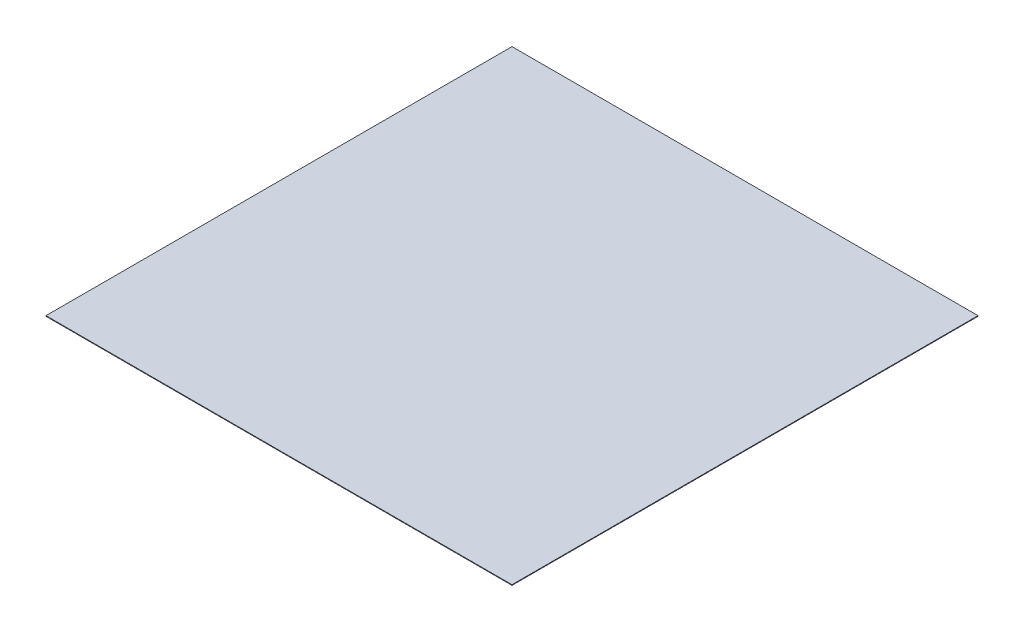
ISO-10303-21;
HEADER;
FILE_DESCRIPTION(('STEP AP214'),'2;1');
FILE_NAME('part.step','',(''),(''),'','','');
FILE_SCHEMA(('AUTOMOTIVE_DESIGN { 1 0 10303 214 1 1 1 1 }'));
ENDSEC;
DATA;
#1=APPLICATION_CONTEXT('core data for automotive mechanical design processes');
#2=APPLICATION_PROTOCOL_DEFINITION('international standard','automotive_design',2000,#1);
#3=PRODUCT_CONTEXT('',#1,'mechanical');
#4=PRODUCT('Part','Part','',(#3));
#5=PRODUCT_RELATED_PRODUCT_CATEGORY('part','',(#4));
#6=PRODUCT_DEFINITION_FORMATION('','',#4);
#7=PRODUCT_DEFINITION_CONTEXT('part definition',#1,'design');
#8=PRODUCT_DEFINITION('design','',#6,#7);
#9=PRODUCT_DEFINITION_SHAPE('','',#8);
#10=(LENGTH_UNIT() NAMED_UNIT(*) SI_UNIT(.MILLI.,.METRE.));
#11=(NAMED_UNIT(*) PLANE_ANGLE_UNIT() SI_UNIT($,.RADIAN.));
#12=(NAMED_UNIT(*) SI_UNIT($,.STERADIAN.) SOLID_ANGLE_UNIT());
#13=UNCERTAINTY_MEASURE_WITH_UNIT(LENGTH_MEASURE(1.E-05),#10,'distance_accuracy_value','');
#14=(GEOMETRIC_REPRESENTATION_CONTEXT(3) GLOBAL_UNCERTAINTY_ASSIGNED_CONTEXT((#13)) GLOBAL_UNIT_ASSIGNED_CONTEXT((#10,
#11,#12)) REPRESENTATION_CONTEXT('',''));
#15=CARTESIAN_POINT('',(0.,0.,0.));
#16=DIRECTION('',(0.,0.,1.));
#17=DIRECTION('',(1.,0.,0.));
#18=AXIS2_PLACEMENT_3D('',#15,#16,#17);
#19=CARTESIAN_POINT('',(0.,0.101600000000035,0.));
#20=DIRECTION('',(1.,0.,0.));
#21=DIRECTION('',(0.,0.,-1.));
#22=AXIS2_PLACEMENT_3D('',#19,#20,#21);
#23=PLANE('',#22);
#24=DIRECTION('',(0.,0.,1.));
#25=VECTOR('',#24,1.);
#26=CARTESIAN_POINT('',(0.,0.,0.));
#27=LINE('',#26,#25);
#28=CARTESIAN_POINT('',(0.,0.,-76.2));
#29=VERTEX_POINT('',#28);
#30=CARTESIAN_POINT('',(0.,0.,0.));
#31=VERTEX_POINT('',#30);
#32=EDGE_CURVE('E93',#29,#31,#27,.T.);
#33=ORIENTED_EDGE('',*,*,#32,.T.);
#34=DIRECTION('',(0.,-1.,0.));
#35=VECTOR('',#34,1.);
#36=CARTESIAN_POINT('',(0.,0.101600000000035,0.));
#37=LINE('',#36,#35);
#38=CARTESIAN_POINT('',(0.,0.101600000000035,0.));
#39=VERTEX_POINT('',#38);
#40=EDGE_CURVE('E11',#39,#31,#37,.T.);
#41=ORIENTED_EDGE('',*,*,#40,.F.);
#42=DIRECTION('',(0.,0.,1.));
#43=VECTOR('',#42,1.);
#44=CARTESIAN_POINT('',(0.,0.101600000000035,0.));
#45=LINE('',#44,#43);
#46=CARTESIAN_POINT('',(0.,0.101600000000035,-76.2));
#47=VERTEX_POINT('',#46);
#48=EDGE_CURVE('E81',#47,#39,#45,.T.);
#49=ORIENTED_EDGE('',*,*,#48,.F.);
#50=DIRECTION('',(0.,-1.,0.));
#51=VECTOR('',#50,1.);
#52=CARTESIAN_POINT('',(0.,0.101600000000035,-76.2));
#53=LINE('',#52,#51);
#54=EDGE_CURVE('E89',#47,#29,#53,.T.);
#55=ORIENTED_EDGE('',*,*,#54,.T.);
#56=EDGE_LOOP('',(#33,#41,#49,#55));
#57=FACE_BOUND('',#56,.T.);
#58=ADVANCED_FACE('F30',(#57),#23,.F.);
#59=CARTESIAN_POINT('',(0.,0.101600000000035,0.));
#60=DIRECTION('',(0.,0.,-1.));
#61=DIRECTION('',(-1.,0.,0.));
#62=AXIS2_PLACEMENT_3D('',#59,#60,#61);
#63=PLANE('',#62);
#64=DIRECTION('',(1.,0.,0.));
#65=VECTOR('',#64,1.);
#66=CARTESIAN_POINT('',(0.,0.,0.));
#67=LINE('',#66,#65);
#68=CARTESIAN_POINT('',(76.2,0.,0.));
#69=VERTEX_POINT('',#68);
#70=EDGE_CURVE('E85',#31,#69,#67,.T.);
#71=ORIENTED_EDGE('',*,*,#70,.T.);
#72=DIRECTION('',(0.,-1.,0.));
#73=VECTOR('',#72,1.);
#74=CARTESIAN_POINT('',(76.2,0.101600000000035,0.));
#75=LINE('',#74,#73);
#76=CARTESIAN_POINT('',(76.2,0.101600000000035,0.));
#77=VERTEX_POINT('',#76);
#78=EDGE_CURVE('E38',#77,#69,#75,.T.);
#79=ORIENTED_EDGE('',*,*,#78,.F.);
#80=DIRECTION('',(1.,0.,0.));
#81=VECTOR('',#80,1.);
#82=CARTESIAN_POINT('',(0.,0.101600000000035,0.));
#83=LINE('',#82,#81);
#84=EDGE_CURVE('E76',#39,#77,#83,.T.);
#85=ORIENTED_EDGE('',*,*,#84,.F.);
#86=ORIENTED_EDGE('',*,*,#40,.T.);
#87=EDGE_LOOP('',(#71,#79,#85,#86));
#88=FACE_BOUND('',#87,.T.);
#89=ADVANCED_FACE('F84',(#88),#63,.F.);
#90=CARTESIAN_POINT('',(76.2,0.101600000000035,0.));
#91=DIRECTION('',(-1.,0.,0.));
#92=DIRECTION('',(0.,0.,1.));
#93=AXIS2_PLACEMENT_3D('',#90,#91,#92);
#94=PLANE('',#93);
#95=DIRECTION('',(0.,0.,-1.));
#96=VECTOR('',#95,1.);
#97=CARTESIAN_POINT('',(76.2,0.,0.));
#98=LINE('',#97,#96);
#99=CARTESIAN_POINT('',(76.2,0.,-76.2));
#100=VERTEX_POINT('',#99);
#101=EDGE_CURVE('E63',#69,#100,#98,.T.);
#102=ORIENTED_EDGE('',*,*,#101,.T.);
#103=DIRECTION('',(0.,-1.,0.));
#104=VECTOR('',#103,1.);
#105=CARTESIAN_POINT('',(76.2,0.101600000000035,-76.2));
#106=LINE('',#105,#104);
#107=CARTESIAN_POINT('',(76.2,0.101600000000035,-76.2));
#108=VERTEX_POINT('',#107);
#109=EDGE_CURVE('E86',#108,#100,#106,.T.);
#110=ORIENTED_EDGE('',*,*,#109,.F.);
#111=DIRECTION('',(0.,0.,-1.));
#112=VECTOR('',#111,1.);
#113=CARTESIAN_POINT('',(76.2,0.101600000000035,0.));
#114=LINE('',#113,#112);
#115=EDGE_CURVE('E79',#77,#108,#114,.T.);
#116=ORIENTED_EDGE('',*,*,#115,.F.);
#117=ORIENTED_EDGE('',*,*,#78,.T.);
#118=EDGE_LOOP('',(#102,#110,#116,#117));
#119=FACE_BOUND('',#118,.T.);
#120=ADVANCED_FACE('F87',(#119),#94,.F.);
#121=CARTESIAN_POINT('',(0.,0.101600000000035,-76.2));
#122=DIRECTION('',(0.,0.,1.));
#123=DIRECTION('',(1.,0.,0.));
#124=AXIS2_PLACEMENT_3D('',#121,#122,#123);
#125=PLANE('',#124);
#126=DIRECTION('',(-1.,0.,0.));
#127=VECTOR('',#126,1.);
#128=CARTESIAN_POINT('',(0.,0.,-76.2));
#129=LINE('',#128,#127);
#130=EDGE_CURVE('E69',#100,#29,#129,.T.);
#131=ORIENTED_EDGE('',*,*,#130,.T.);
#132=ORIENTED_EDGE('',*,*,#54,.F.);
#133=DIRECTION('',(-1.,0.,0.));
#134=VECTOR('',#133,1.);
#135=CARTESIAN_POINT('',(0.,0.101600000000035,-76.2));
#136=LINE('',#135,#134);
#137=EDGE_CURVE('E46',#108,#47,#136,.T.);
#138=ORIENTED_EDGE('',*,*,#137,.F.);
#139=ORIENTED_EDGE('',*,*,#109,.T.);
#140=EDGE_LOOP('',(#131,#132,#138,#139));
#141=FACE_BOUND('',#140,.T.);
#142=ADVANCED_FACE('F100',(#141),#125,.F.);
#143=CARTESIAN_POINT('',(0.,0.101600000000035,0.));
#144=DIRECTION('',(0.,-1.,0.));
#145=DIRECTION('',(0.,0.,-1.));
#146=AXIS2_PLACEMENT_3D('',#143,#144,#145);
#147=PLANE('',#146);
#148=ORIENTED_EDGE('',*,*,#48,.T.);
#149=ORIENTED_EDGE('',*,*,#84,.T.);
#150=ORIENTED_EDGE('',*,*,#115,.T.);
#151=ORIENTED_EDGE('',*,*,#137,.T.);
#152=EDGE_LOOP('',(#148,#149,#150,#151));
#153=FACE_BOUND('',#152,.T.);
#154=ADVANCED_FACE('F77',(#153),#147,.F.);
#155=CARTESIAN_POINT('',(0.,0.,0.));
#156=DIRECTION('',(0.,-1.,0.));
#157=DIRECTION('',(0.,0.,-1.));
#158=AXIS2_PLACEMENT_3D('',#155,#156,#157);
#159=PLANE('',#158);
#160=ORIENTED_EDGE('',*,*,#32,.F.);
#161=ORIENTED_EDGE('',*,*,#130,.F.);
#162=ORIENTED_EDGE('',*,*,#101,.F.);
#163=ORIENTED_EDGE('',*,*,#70,.F.);
#164=EDGE_LOOP('',(#160,#161,#162,#163));
#165=FACE_BOUND('',#164,.T.);
#166=ADVANCED_FACE('F103',(#165),#159,.T.);
#167=CLOSED_SHELL('',(#58,#89,#120,#142,#154,#166));
#168=MANIFOLD_SOLID_BREP('B2',#167);
#169=ADVANCED_BREP_SHAPE_REPRESENTATION('',(#18,#168),#14);
#170=SHAPE_DEFINITION_REPRESENTATION(#9,#169);
ENDSEC;
END-ISO-10303-21;
